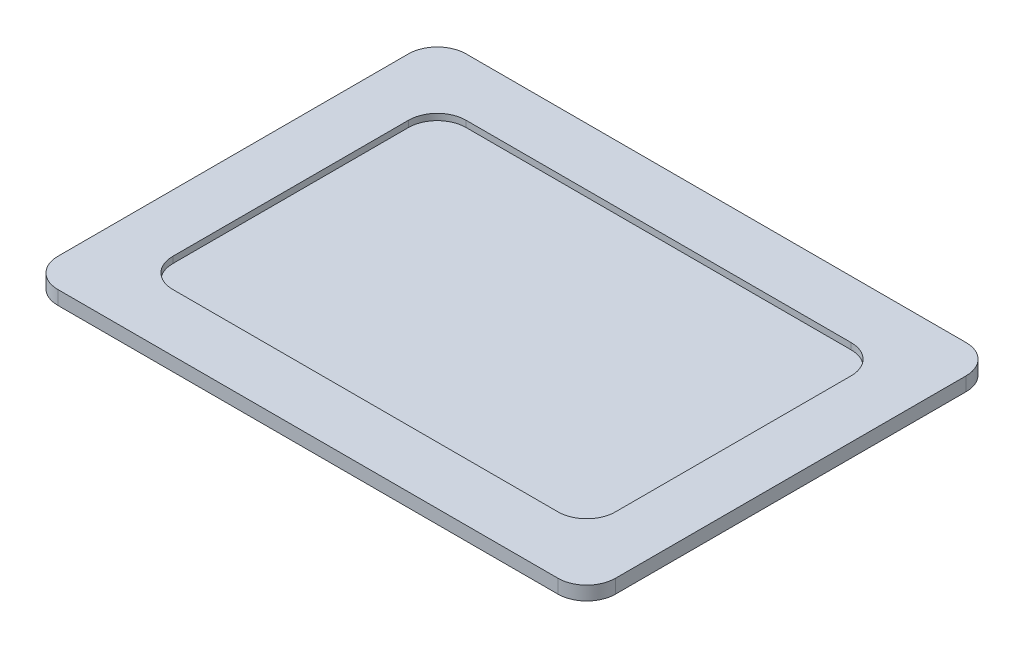
ISO-10303-21;
HEADER;
FILE_DESCRIPTION(('STEP AP214'),'2;1');
FILE_NAME('part.step','',(''),(''),'','','');
FILE_SCHEMA(('AUTOMOTIVE_DESIGN { 1 0 10303 214 1 1 1 1 }'));
ENDSEC;
DATA;
#1=APPLICATION_CONTEXT('core data for automotive mechanical design processes');
#2=APPLICATION_PROTOCOL_DEFINITION('international standard','automotive_design',2000,#1);
#3=PRODUCT_CONTEXT('',#1,'mechanical');
#4=PRODUCT('Part','Part','',(#3));
#5=PRODUCT_RELATED_PRODUCT_CATEGORY('part','',(#4));
#6=PRODUCT_DEFINITION_FORMATION('','',#4);
#7=PRODUCT_DEFINITION_CONTEXT('part definition',#1,'design');
#8=PRODUCT_DEFINITION('design','',#6,#7);
#9=PRODUCT_DEFINITION_SHAPE('','',#8);
#10=(LENGTH_UNIT() NAMED_UNIT(*) SI_UNIT(.MILLI.,.METRE.));
#11=(NAMED_UNIT(*) PLANE_ANGLE_UNIT() SI_UNIT($,.RADIAN.));
#12=(NAMED_UNIT(*) SI_UNIT($,.STERADIAN.) SOLID_ANGLE_UNIT());
#13=UNCERTAINTY_MEASURE_WITH_UNIT(LENGTH_MEASURE(1.E-05),#10,'distance_accuracy_value','');
#14=(GEOMETRIC_REPRESENTATION_CONTEXT(3) GLOBAL_UNCERTAINTY_ASSIGNED_CONTEXT((#13)) GLOBAL_UNIT_ASSIGNED_CONTEXT((#10,
#11,#12)) REPRESENTATION_CONTEXT('',''));
#15=CARTESIAN_POINT('',(0.,0.,0.));
#16=DIRECTION('',(0.,0.,1.));
#17=DIRECTION('',(1.,0.,0.));
#18=AXIS2_PLACEMENT_3D('',#15,#16,#17);
#19=CARTESIAN_POINT('',(48.5,-1.2,35.5));
#20=DIRECTION('',(1.,0.,0.));
#21=DIRECTION('',(0.,0.,-1.));
#22=AXIS2_PLACEMENT_3D('',#19,#20,#21);
#23=PLANE('',#22);
#24=DIRECTION('',(0.,0.,-1.));
#25=VECTOR('',#24,1.);
#26=CARTESIAN_POINT('',(48.5,-1.2,35.5));
#27=LINE('',#26,#25);
#28=CARTESIAN_POINT('',(48.5,-1.2,30.5));
#29=VERTEX_POINT('',#28);
#30=CARTESIAN_POINT('',(48.5,-1.2,-30.5));
#31=VERTEX_POINT('',#30);
#32=EDGE_CURVE('E339',#29,#31,#27,.T.);
#33=ORIENTED_EDGE('',*,*,#32,.T.);
#34=DIRECTION('',(0.,1.,0.));
#35=VECTOR('',#34,1.);
#36=CARTESIAN_POINT('',(48.5,-1.2,-30.5));
#37=LINE('',#36,#35);
#38=CARTESIAN_POINT('',(48.5,1.2,-30.5));
#39=VERTEX_POINT('',#38);
#40=EDGE_CURVE('E300',#31,#39,#37,.T.);
#41=ORIENTED_EDGE('',*,*,#40,.T.);
#42=DIRECTION('',(0.,0.,-1.));
#43=VECTOR('',#42,1.);
#44=CARTESIAN_POINT('',(48.5,1.2,35.5));
#45=LINE('',#44,#43);
#46=CARTESIAN_POINT('',(48.5,1.2,30.5));
#47=VERTEX_POINT('',#46);
#48=EDGE_CURVE('E362',#47,#39,#45,.T.);
#49=ORIENTED_EDGE('',*,*,#48,.F.);
#50=DIRECTION('',(0.,1.,0.));
#51=VECTOR('',#50,1.);
#52=CARTESIAN_POINT('',(48.5,-1.2,30.5));
#53=LINE('',#52,#51);
#54=EDGE_CURVE('E298',#47,#29,#53,.F.);
#55=ORIENTED_EDGE('',*,*,#54,.T.);
#56=EDGE_LOOP('',(#33,#41,#49,#55));
#57=FACE_BOUND('',#56,.T.);
#58=ADVANCED_FACE('F39',(#57),#23,.T.);
#59=CARTESIAN_POINT('',(-48.5,-1.2,35.5));
#60=DIRECTION('',(0.,0.,1.));
#61=DIRECTION('',(1.,0.,0.));
#62=AXIS2_PLACEMENT_3D('',#59,#60,#61);
#63=PLANE('',#62);
#64=DIRECTION('',(1.,0.,0.));
#65=VECTOR('',#64,1.);
#66=CARTESIAN_POINT('',(-48.5,1.2,35.5));
#67=LINE('',#66,#65);
#68=CARTESIAN_POINT('',(-43.5,1.2,35.5));
#69=VERTEX_POINT('',#68);
#70=CARTESIAN_POINT('',(43.5,1.2,35.5));
#71=VERTEX_POINT('',#70);
#72=EDGE_CURVE('E332',#69,#71,#67,.T.);
#73=ORIENTED_EDGE('',*,*,#72,.F.);
#74=DIRECTION('',(0.,1.,0.));
#75=VECTOR('',#74,1.);
#76=CARTESIAN_POINT('',(-43.5,-1.2,35.5));
#77=LINE('',#76,#75);
#78=CARTESIAN_POINT('',(-43.5,-1.2,35.5));
#79=VERTEX_POINT('',#78);
#80=EDGE_CURVE('E12',#69,#79,#77,.F.);
#81=ORIENTED_EDGE('',*,*,#80,.T.);
#82=DIRECTION('',(1.,0.,0.));
#83=VECTOR('',#82,1.);
#84=CARTESIAN_POINT('',(-48.5,-1.2,35.5));
#85=LINE('',#84,#83);
#86=CARTESIAN_POINT('',(43.5,-1.2,35.5));
#87=VERTEX_POINT('',#86);
#88=EDGE_CURVE('E229',#79,#87,#85,.T.);
#89=ORIENTED_EDGE('',*,*,#88,.T.);
#90=DIRECTION('',(0.,1.,0.));
#91=VECTOR('',#90,1.);
#92=CARTESIAN_POINT('',(43.5,-1.2,35.5));
#93=LINE('',#92,#91);
#94=EDGE_CURVE('E47',#87,#71,#93,.T.);
#95=ORIENTED_EDGE('',*,*,#94,.T.);
#96=EDGE_LOOP('',(#73,#81,#89,#95));
#97=FACE_BOUND('',#96,.T.);
#98=ADVANCED_FACE('F331',(#97),#63,.T.);
#99=CARTESIAN_POINT('',(-48.5,-1.2,35.5));
#100=DIRECTION('',(-1.,0.,0.));
#101=DIRECTION('',(0.,0.,1.));
#102=AXIS2_PLACEMENT_3D('',#99,#100,#101);
#103=PLANE('',#102);
#104=DIRECTION('',(0.,0.,1.));
#105=VECTOR('',#104,1.);
#106=CARTESIAN_POINT('',(-48.5,-1.2,35.5));
#107=LINE('',#106,#105);
#108=CARTESIAN_POINT('',(-48.5,-1.2,-30.5));
#109=VERTEX_POINT('',#108);
#110=CARTESIAN_POINT('',(-48.5,-1.2,30.5));
#111=VERTEX_POINT('',#110);
#112=EDGE_CURVE('E234',#109,#111,#107,.T.);
#113=ORIENTED_EDGE('',*,*,#112,.T.);
#114=DIRECTION('',(0.,1.,0.));
#115=VECTOR('',#114,1.);
#116=CARTESIAN_POINT('',(-48.5,-1.2,30.5));
#117=LINE('',#116,#115);
#118=CARTESIAN_POINT('',(-48.5,1.2,30.5));
#119=VERTEX_POINT('',#118);
#120=EDGE_CURVE('E324',#111,#119,#117,.T.);
#121=ORIENTED_EDGE('',*,*,#120,.T.);
#122=DIRECTION('',(0.,0.,1.));
#123=VECTOR('',#122,1.);
#124=CARTESIAN_POINT('',(-48.5,1.2,35.5));
#125=LINE('',#124,#123);
#126=CARTESIAN_POINT('',(-48.5,1.2,-30.5));
#127=VERTEX_POINT('',#126);
#128=EDGE_CURVE('E340',#127,#119,#125,.T.);
#129=ORIENTED_EDGE('',*,*,#128,.F.);
#130=DIRECTION('',(0.,1.,0.));
#131=VECTOR('',#130,1.);
#132=CARTESIAN_POINT('',(-48.5,-1.2,-30.5));
#133=LINE('',#132,#131);
#134=EDGE_CURVE('E61',#127,#109,#133,.F.);
#135=ORIENTED_EDGE('',*,*,#134,.T.);
#136=EDGE_LOOP('',(#113,#121,#129,#135));
#137=FACE_BOUND('',#136,.T.);
#138=ADVANCED_FACE('F351',(#137),#103,.T.);
#139=CARTESIAN_POINT('',(-48.5,-1.2,-35.5));
#140=DIRECTION('',(0.,0.,-1.));
#141=DIRECTION('',(-1.,0.,0.));
#142=AXIS2_PLACEMENT_3D('',#139,#140,#141);
#143=PLANE('',#142);
#144=DIRECTION('',(-1.,0.,0.));
#145=VECTOR('',#144,1.);
#146=CARTESIAN_POINT('',(-48.5,1.2,-35.5));
#147=LINE('',#146,#145);
#148=CARTESIAN_POINT('',(43.5,1.2,-35.5));
#149=VERTEX_POINT('',#148);
#150=CARTESIAN_POINT('',(-43.5,1.2,-35.5));
#151=VERTEX_POINT('',#150);
#152=EDGE_CURVE('E345',#149,#151,#147,.T.);
#153=ORIENTED_EDGE('',*,*,#152,.F.);
#154=DIRECTION('',(0.,1.,0.));
#155=VECTOR('',#154,1.);
#156=CARTESIAN_POINT('',(43.5,-1.2,-35.5));
#157=LINE('',#156,#155);
#158=CARTESIAN_POINT('',(43.5,-1.2,-35.5));
#159=VERTEX_POINT('',#158);
#160=EDGE_CURVE('E314',#149,#159,#157,.F.);
#161=ORIENTED_EDGE('',*,*,#160,.T.);
#162=DIRECTION('',(-1.,0.,0.));
#163=VECTOR('',#162,1.);
#164=CARTESIAN_POINT('',(-48.5,-1.2,-35.5));
#165=LINE('',#164,#163);
#166=CARTESIAN_POINT('',(-43.5,-1.2,-35.5));
#167=VERTEX_POINT('',#166);
#168=EDGE_CURVE('E343',#159,#167,#165,.T.);
#169=ORIENTED_EDGE('',*,*,#168,.T.);
#170=DIRECTION('',(0.,1.,0.));
#171=VECTOR('',#170,1.);
#172=CARTESIAN_POINT('',(-43.5,-1.2,-35.5));
#173=LINE('',#172,#171);
#174=EDGE_CURVE('E311',#167,#151,#173,.T.);
#175=ORIENTED_EDGE('',*,*,#174,.T.);
#176=EDGE_LOOP('',(#153,#161,#169,#175));
#177=FACE_BOUND('',#176,.T.);
#178=ADVANCED_FACE('F462',(#177),#143,.T.);
#179=CARTESIAN_POINT('',(0.,-1.2,0.));
#180=DIRECTION('',(0.,-1.,0.));
#181=DIRECTION('',(0.,0.,-1.));
#182=AXIS2_PLACEMENT_3D('',#179,#180,#181);
#183=PLANE('',#182);
#184=DIRECTION('',(0.,0.,-1.));
#185=VECTOR('',#184,1.);
#186=CARTESIAN_POINT('',(-38.5,-1.2,25.5));
#187=LINE('',#186,#185);
#188=CARTESIAN_POINT('',(-38.5,-1.2,20.5));
#189=VERTEX_POINT('',#188);
#190=CARTESIAN_POINT('',(-38.5,-1.2,-20.5));
#191=VERTEX_POINT('',#190);
#192=EDGE_CURVE('E392',#189,#191,#187,.T.);
#193=ORIENTED_EDGE('',*,*,#192,.F.);
#194=CARTESIAN_POINT('',(-33.5,-1.20000000000001,20.5));
#195=DIRECTION('',(0.,-1.,0.));
#196=DIRECTION('',(0.,0.,-1.));
#197=AXIS2_PLACEMENT_3D('',#194,#195,#196);
#198=CIRCLE('',#197,5.);
#199=CARTESIAN_POINT('',(-33.5,-1.2,25.5));
#200=VERTEX_POINT('',#199);
#201=EDGE_CURVE('E292',#189,#200,#198,.F.);
#202=ORIENTED_EDGE('',*,*,#201,.T.);
#203=DIRECTION('',(1.,0.,0.));
#204=VECTOR('',#203,1.);
#205=CARTESIAN_POINT('',(-38.5,-1.2,25.5));
#206=LINE('',#205,#204);
#207=CARTESIAN_POINT('',(33.5,-1.2,25.5));
#208=VERTEX_POINT('',#207);
#209=EDGE_CURVE('E377',#200,#208,#206,.T.);
#210=ORIENTED_EDGE('',*,*,#209,.T.);
#211=CARTESIAN_POINT('',(33.5,-1.20000000000001,20.5));
#212=DIRECTION('',(0.,-1.,0.));
#213=DIRECTION('',(0.,0.,-1.));
#214=AXIS2_PLACEMENT_3D('',#211,#212,#213);
#215=CIRCLE('',#214,5.);
#216=CARTESIAN_POINT('',(38.5,-1.2,20.5));
#217=VERTEX_POINT('',#216);
#218=EDGE_CURVE('E294',#208,#217,#215,.F.);
#219=ORIENTED_EDGE('',*,*,#218,.T.);
#220=DIRECTION('',(0.,0.,-1.));
#221=VECTOR('',#220,1.);
#222=CARTESIAN_POINT('',(38.5,-1.2,25.5));
#223=LINE('',#222,#221);
#224=CARTESIAN_POINT('',(38.5,-1.2,-20.5));
#225=VERTEX_POINT('',#224);
#226=EDGE_CURVE('E387',#217,#225,#223,.T.);
#227=ORIENTED_EDGE('',*,*,#226,.T.);
#228=CARTESIAN_POINT('',(33.5,-1.20000000000001,-20.5));
#229=DIRECTION('',(0.,-1.,0.));
#230=DIRECTION('',(0.,0.,-1.));
#231=AXIS2_PLACEMENT_3D('',#228,#229,#230);
#232=CIRCLE('',#231,5.);
#233=CARTESIAN_POINT('',(33.5,-1.2,-25.5));
#234=VERTEX_POINT('',#233);
#235=EDGE_CURVE('E290',#225,#234,#232,.F.);
#236=ORIENTED_EDGE('',*,*,#235,.T.);
#237=DIRECTION('',(1.,0.,0.));
#238=VECTOR('',#237,1.);
#239=CARTESIAN_POINT('',(-38.5,-1.2,-25.5));
#240=LINE('',#239,#238);
#241=CARTESIAN_POINT('',(-33.5,-1.2,-25.5));
#242=VERTEX_POINT('',#241);
#243=EDGE_CURVE('E398',#242,#234,#240,.T.);
#244=ORIENTED_EDGE('',*,*,#243,.F.);
#245=CARTESIAN_POINT('',(-33.5,-1.20000000000001,-20.5));
#246=DIRECTION('',(0.,-1.,0.));
#247=DIRECTION('',(0.,0.,-1.));
#248=AXIS2_PLACEMENT_3D('',#245,#246,#247);
#249=CIRCLE('',#248,5.);
#250=EDGE_CURVE('E296',#242,#191,#249,.F.);
#251=ORIENTED_EDGE('',*,*,#250,.T.);
#252=EDGE_LOOP('',(#193,#202,#210,#219,#227,#236,#244,#251));
#253=FACE_BOUND('',#252,.T.);
#254=ORIENTED_EDGE('',*,*,#168,.F.);
#255=CARTESIAN_POINT('',(43.5,-1.2,-30.5));
#256=DIRECTION('',(0.,-1.,0.));
#257=DIRECTION('',(0.,0.,-1.));
#258=AXIS2_PLACEMENT_3D('',#255,#256,#257);
#259=CIRCLE('',#258,5.);
#260=EDGE_CURVE('E321',#159,#31,#259,.T.);
#261=ORIENTED_EDGE('',*,*,#260,.T.);
#262=ORIENTED_EDGE('',*,*,#32,.F.);
#263=CARTESIAN_POINT('',(43.5,-1.2,30.5));
#264=DIRECTION('',(0.,-1.,0.));
#265=DIRECTION('',(0.,0.,-1.));
#266=AXIS2_PLACEMENT_3D('',#263,#264,#265);
#267=CIRCLE('',#266,5.);
#268=EDGE_CURVE('E318',#29,#87,#267,.T.);
#269=ORIENTED_EDGE('',*,*,#268,.T.);
#270=ORIENTED_EDGE('',*,*,#88,.F.);
#271=CARTESIAN_POINT('',(-43.5,-1.2,30.5));
#272=DIRECTION('',(0.,-1.,0.));
#273=DIRECTION('',(0.,0.,-1.));
#274=AXIS2_PLACEMENT_3D('',#271,#272,#273);
#275=CIRCLE('',#274,5.);
#276=EDGE_CURVE('E54',#79,#111,#275,.T.);
#277=ORIENTED_EDGE('',*,*,#276,.T.);
#278=ORIENTED_EDGE('',*,*,#112,.F.);
#279=CARTESIAN_POINT('',(-43.5,-1.2,-30.5));
#280=DIRECTION('',(0.,-1.,0.));
#281=DIRECTION('',(0.,0.,-1.));
#282=AXIS2_PLACEMENT_3D('',#279,#280,#281);
#283=CIRCLE('',#282,5.);
#284=EDGE_CURVE('E316',#109,#167,#283,.T.);
#285=ORIENTED_EDGE('',*,*,#284,.T.);
#286=EDGE_LOOP('',(#254,#261,#262,#269,#270,#277,#278,#285));
#287=FACE_BOUND('',#286,.T.);
#288=ADVANCED_FACE('F356',(#253,#287),#183,.T.);
#289=CARTESIAN_POINT('',(0.,1.2,0.));
#290=DIRECTION('',(0.,-1.,0.));
#291=DIRECTION('',(0.,0.,-1.));
#292=AXIS2_PLACEMENT_3D('',#289,#290,#291);
#293=PLANE('',#292);
#294=DIRECTION('',(0.,0.,-1.));
#295=VECTOR('',#294,1.);
#296=CARTESIAN_POINT('',(38.5,1.2,25.5));
#297=LINE('',#296,#295);
#298=CARTESIAN_POINT('',(38.5,1.2,20.5));
#299=VERTEX_POINT('',#298);
#300=CARTESIAN_POINT('',(38.5,1.2,-20.5));
#301=VERTEX_POINT('',#300);
#302=EDGE_CURVE('E224',#299,#301,#297,.T.);
#303=ORIENTED_EDGE('',*,*,#302,.F.);
#304=CARTESIAN_POINT('',(33.5,1.20000000000001,20.5));
#305=DIRECTION('',(0.,-1.,0.));
#306=DIRECTION('',(0.,0.,-1.));
#307=AXIS2_PLACEMENT_3D('',#304,#305,#306);
#308=CIRCLE('',#307,5.);
#309=CARTESIAN_POINT('',(33.5,1.2,25.5));
#310=VERTEX_POINT('',#309);
#311=EDGE_CURVE('E214',#299,#310,#308,.T.);
#312=ORIENTED_EDGE('',*,*,#311,.T.);
#313=DIRECTION('',(1.,0.,0.));
#314=VECTOR('',#313,1.);
#315=CARTESIAN_POINT('',(-38.5,1.2,25.5));
#316=LINE('',#315,#314);
#317=CARTESIAN_POINT('',(-33.5,1.2,25.5));
#318=VERTEX_POINT('',#317);
#319=EDGE_CURVE('E374',#318,#310,#316,.T.);
#320=ORIENTED_EDGE('',*,*,#319,.F.);
#321=CARTESIAN_POINT('',(-33.5,1.20000000000001,20.5));
#322=DIRECTION('',(0.,-1.,0.));
#323=DIRECTION('',(0.,0.,-1.));
#324=AXIS2_PLACEMENT_3D('',#321,#322,#323);
#325=CIRCLE('',#324,5.);
#326=CARTESIAN_POINT('',(-38.5,1.2,20.5));
#327=VERTEX_POINT('',#326);
#328=EDGE_CURVE('E260',#318,#327,#325,.T.);
#329=ORIENTED_EDGE('',*,*,#328,.T.);
#330=DIRECTION('',(0.,0.,-1.));
#331=VECTOR('',#330,1.);
#332=CARTESIAN_POINT('',(-38.5,1.2,25.5));
#333=LINE('',#332,#331);
#334=CARTESIAN_POINT('',(-38.5,1.2,-20.5));
#335=VERTEX_POINT('',#334);
#336=EDGE_CURVE('E208',#327,#335,#333,.T.);
#337=ORIENTED_EDGE('',*,*,#336,.T.);
#338=CARTESIAN_POINT('',(-33.5,1.20000000000001,-20.5));
#339=DIRECTION('',(0.,-1.,0.));
#340=DIRECTION('',(0.,0.,-1.));
#341=AXIS2_PLACEMENT_3D('',#338,#339,#340);
#342=CIRCLE('',#341,5.);
#343=CARTESIAN_POINT('',(-33.5,1.2,-25.5));
#344=VERTEX_POINT('',#343);
#345=EDGE_CURVE('E201',#335,#344,#342,.T.);
#346=ORIENTED_EDGE('',*,*,#345,.T.);
#347=DIRECTION('',(1.,0.,0.));
#348=VECTOR('',#347,1.);
#349=CARTESIAN_POINT('',(-38.5,1.2,-25.5));
#350=LINE('',#349,#348);
#351=CARTESIAN_POINT('',(33.5,1.2,-25.5));
#352=VERTEX_POINT('',#351);
#353=EDGE_CURVE('E206',#344,#352,#350,.T.);
#354=ORIENTED_EDGE('',*,*,#353,.T.);
#355=CARTESIAN_POINT('',(33.5,1.20000000000001,-20.5));
#356=DIRECTION('',(0.,-1.,0.));
#357=DIRECTION('',(0.,0.,-1.));
#358=AXIS2_PLACEMENT_3D('',#355,#356,#357);
#359=CIRCLE('',#358,5.);
#360=EDGE_CURVE('E258',#352,#301,#359,.T.);
#361=ORIENTED_EDGE('',*,*,#360,.T.);
#362=EDGE_LOOP('',(#303,#312,#320,#329,#337,#346,#354,#361));
#363=FACE_BOUND('',#362,.T.);
#364=ORIENTED_EDGE('',*,*,#48,.T.);
#365=CARTESIAN_POINT('',(43.5,1.2,-30.5));
#366=DIRECTION('',(0.,-1.,0.));
#367=DIRECTION('',(0.,0.,-1.));
#368=AXIS2_PLACEMENT_3D('',#365,#366,#367);
#369=CIRCLE('',#368,5.);
#370=EDGE_CURVE('E309',#39,#149,#369,.F.);
#371=ORIENTED_EDGE('',*,*,#370,.T.);
#372=ORIENTED_EDGE('',*,*,#152,.T.);
#373=CARTESIAN_POINT('',(-43.5,1.2,-30.5));
#374=DIRECTION('',(0.,-1.,0.));
#375=DIRECTION('',(0.,0.,-1.));
#376=AXIS2_PLACEMENT_3D('',#373,#374,#375);
#377=CIRCLE('',#376,5.);
#378=EDGE_CURVE('E303',#151,#127,#377,.F.);
#379=ORIENTED_EDGE('',*,*,#378,.T.);
#380=ORIENTED_EDGE('',*,*,#128,.T.);
#381=CARTESIAN_POINT('',(-43.5,1.2,30.5));
#382=DIRECTION('',(0.,-1.,0.));
#383=DIRECTION('',(0.,0.,-1.));
#384=AXIS2_PLACEMENT_3D('',#381,#382,#383);
#385=CIRCLE('',#384,5.);
#386=EDGE_CURVE('E307',#119,#69,#385,.F.);
#387=ORIENTED_EDGE('',*,*,#386,.T.);
#388=ORIENTED_EDGE('',*,*,#72,.T.);
#389=CARTESIAN_POINT('',(43.5,1.2,30.5));
#390=DIRECTION('',(0.,-1.,0.));
#391=DIRECTION('',(0.,0.,-1.));
#392=AXIS2_PLACEMENT_3D('',#389,#390,#391);
#393=CIRCLE('',#392,5.);
#394=EDGE_CURVE('E305',#71,#47,#393,.F.);
#395=ORIENTED_EDGE('',*,*,#394,.T.);
#396=EDGE_LOOP('',(#364,#371,#372,#379,#380,#387,#388,#395));
#397=FACE_BOUND('',#396,.T.);
#398=ADVANCED_FACE('F204',(#363,#397),#293,.F.);
#399=CARTESIAN_POINT('',(-38.5,-92.3579991121505,25.5));
#400=DIRECTION('',(0.,0.,1.));
#401=DIRECTION('',(1.,0.,0.));
#402=AXIS2_PLACEMENT_3D('',#399,#400,#401);
#403=PLANE('',#402);
#404=DIRECTION('',(-1.,0.,0.));
#405=VECTOR('',#404,1.);
#406=CARTESIAN_POINT('',(-38.5,0.100000000000003,25.5));
#407=LINE('',#406,#405);
#408=CARTESIAN_POINT('',(33.5,0.100000000000003,25.5));
#409=VERTEX_POINT('',#408);
#410=CARTESIAN_POINT('',(-33.5,0.100000000000003,25.5));
#411=VERTEX_POINT('',#410);
#412=EDGE_CURVE('E367',#409,#411,#407,.T.);
#413=ORIENTED_EDGE('',*,*,#412,.T.);
#414=DIRECTION('',(0.,1.,0.));
#415=VECTOR('',#414,1.);
#416=CARTESIAN_POINT('',(-33.5,-92.3579991121505,25.5));
#417=LINE('',#416,#415);
#418=EDGE_CURVE('E251',#411,#318,#417,.T.);
#419=ORIENTED_EDGE('',*,*,#418,.T.);
#420=ORIENTED_EDGE('',*,*,#319,.T.);
#421=DIRECTION('',(0.,1.,0.));
#422=VECTOR('',#421,1.);
#423=CARTESIAN_POINT('',(33.5,0.100000000000003,25.5));
#424=LINE('',#423,#422);
#425=EDGE_CURVE('E249',#310,#409,#424,.F.);
#426=ORIENTED_EDGE('',*,*,#425,.T.);
#427=EDGE_LOOP('',(#413,#419,#420,#426));
#428=FACE_BOUND('',#427,.T.);
#429=ADVANCED_FACE('F494',(#428),#403,.F.);
#430=CARTESIAN_POINT('',(-38.5,-92.3579991121505,25.5));
#431=DIRECTION('',(1.,0.,0.));
#432=DIRECTION('',(0.,0.,-1.));
#433=AXIS2_PLACEMENT_3D('',#430,#431,#432);
#434=PLANE('',#433);
#435=ORIENTED_EDGE('',*,*,#336,.F.);
#436=DIRECTION('',(0.,1.,0.));
#437=VECTOR('',#436,1.);
#438=CARTESIAN_POINT('',(-38.5,-92.3579991121505,20.5));
#439=LINE('',#438,#437);
#440=CARTESIAN_POINT('',(-38.5,0.100000000000003,20.5));
#441=VERTEX_POINT('',#440);
#442=EDGE_CURVE('E256',#327,#441,#439,.F.);
#443=ORIENTED_EDGE('',*,*,#442,.T.);
#444=DIRECTION('',(0.,0.,1.));
#445=VECTOR('',#444,1.);
#446=CARTESIAN_POINT('',(-38.5,0.100000000000003,25.5));
#447=LINE('',#446,#445);
#448=CARTESIAN_POINT('',(-38.5,0.100000000000003,-20.5));
#449=VERTEX_POINT('',#448);
#450=EDGE_CURVE('E380',#449,#441,#447,.T.);
#451=ORIENTED_EDGE('',*,*,#450,.F.);
#452=DIRECTION('',(0.,1.,0.));
#453=VECTOR('',#452,1.);
#454=CARTESIAN_POINT('',(-38.5,1.20000000000001,-20.5));
#455=LINE('',#454,#453);
#456=EDGE_CURVE('E254',#449,#335,#455,.T.);
#457=ORIENTED_EDGE('',*,*,#456,.T.);
#458=EDGE_LOOP('',(#435,#443,#451,#457));
#459=FACE_BOUND('',#458,.T.);
#460=ADVANCED_FACE('F491',(#459),#434,.T.);
#461=CARTESIAN_POINT('',(-38.5,-92.3579991121505,-25.5));
#462=DIRECTION('',(0.,0.,1.));
#463=DIRECTION('',(1.,0.,0.));
#464=AXIS2_PLACEMENT_3D('',#461,#462,#463);
#465=PLANE('',#464);
#466=DIRECTION('',(-1.,0.,0.));
#467=VECTOR('',#466,1.);
#468=CARTESIAN_POINT('',(-38.5,0.100000000000003,-25.5));
#469=LINE('',#468,#467);
#470=CARTESIAN_POINT('',(33.5,0.100000000000003,-25.5));
#471=VERTEX_POINT('',#470);
#472=CARTESIAN_POINT('',(-33.5,0.100000000000003,-25.5));
#473=VERTEX_POINT('',#472);
#474=EDGE_CURVE('E370',#471,#473,#469,.T.);
#475=ORIENTED_EDGE('',*,*,#474,.F.);
#476=DIRECTION('',(0.,1.,0.));
#477=VECTOR('',#476,1.);
#478=CARTESIAN_POINT('',(33.5,-92.3579991121505,-25.5));
#479=LINE('',#478,#477);
#480=EDGE_CURVE('E223',#471,#352,#479,.T.);
#481=ORIENTED_EDGE('',*,*,#480,.T.);
#482=ORIENTED_EDGE('',*,*,#353,.F.);
#483=DIRECTION('',(0.,1.,0.));
#484=VECTOR('',#483,1.);
#485=CARTESIAN_POINT('',(-33.5,0.100000000000003,-25.5));
#486=LINE('',#485,#484);
#487=EDGE_CURVE('E220',#344,#473,#486,.F.);
#488=ORIENTED_EDGE('',*,*,#487,.T.);
#489=EDGE_LOOP('',(#475,#481,#482,#488));
#490=FACE_BOUND('',#489,.T.);
#491=ADVANCED_FACE('F219',(#490),#465,.T.);
#492=CARTESIAN_POINT('',(38.5,-92.3579991121505,25.5));
#493=DIRECTION('',(1.,0.,0.));
#494=DIRECTION('',(0.,0.,-1.));
#495=AXIS2_PLACEMENT_3D('',#492,#493,#494);
#496=PLANE('',#495);
#497=ORIENTED_EDGE('',*,*,#302,.T.);
#498=DIRECTION('',(0.,1.,0.));
#499=VECTOR('',#498,1.);
#500=CARTESIAN_POINT('',(38.5,-92.3579991121505,-20.5));
#501=LINE('',#500,#499);
#502=CARTESIAN_POINT('',(38.5,0.100000000000003,-20.5));
#503=VERTEX_POINT('',#502);
#504=EDGE_CURVE('E240',#301,#503,#501,.F.);
#505=ORIENTED_EDGE('',*,*,#504,.T.);
#506=DIRECTION('',(0.,0.,1.));
#507=VECTOR('',#506,1.);
#508=CARTESIAN_POINT('',(38.5,0.100000000000003,25.5));
#509=LINE('',#508,#507);
#510=CARTESIAN_POINT('',(38.5,0.100000000000003,20.5));
#511=VERTEX_POINT('',#510);
#512=EDGE_CURVE('E363',#503,#511,#509,.T.);
#513=ORIENTED_EDGE('',*,*,#512,.T.);
#514=DIRECTION('',(0.,1.,0.));
#515=VECTOR('',#514,1.);
#516=CARTESIAN_POINT('',(38.5,1.20000000000001,20.5));
#517=LINE('',#516,#515);
#518=EDGE_CURVE('E231',#511,#299,#517,.T.);
#519=ORIENTED_EDGE('',*,*,#518,.T.);
#520=EDGE_LOOP('',(#497,#505,#513,#519));
#521=FACE_BOUND('',#520,.T.);
#522=ADVANCED_FACE('F489',(#521),#496,.F.);
#523=CARTESIAN_POINT('',(0.,0.1,0.));
#524=DIRECTION('',(0.,1.,0.));
#525=DIRECTION('',(0.,0.,1.));
#526=AXIS2_PLACEMENT_3D('',#523,#524,#525);
#527=PLANE('',#526);
#528=ORIENTED_EDGE('',*,*,#512,.F.);
#529=CARTESIAN_POINT('',(33.5,0.100000000000003,-20.5));
#530=DIRECTION('',(0.,1.,0.));
#531=DIRECTION('',(0.,0.,1.));
#532=AXIS2_PLACEMENT_3D('',#529,#530,#531);
#533=CIRCLE('',#532,5.);
#534=EDGE_CURVE('E247',#503,#471,#533,.T.);
#535=ORIENTED_EDGE('',*,*,#534,.T.);
#536=ORIENTED_EDGE('',*,*,#474,.T.);
#537=CARTESIAN_POINT('',(-33.5,0.100000000000003,-20.5));
#538=DIRECTION('',(0.,1.,0.));
#539=DIRECTION('',(0.,0.,1.));
#540=AXIS2_PLACEMENT_3D('',#537,#538,#539);
#541=CIRCLE('',#540,5.);
#542=EDGE_CURVE('E228',#473,#449,#541,.T.);
#543=ORIENTED_EDGE('',*,*,#542,.T.);
#544=ORIENTED_EDGE('',*,*,#450,.T.);
#545=CARTESIAN_POINT('',(-33.5,0.100000000000003,20.5));
#546=DIRECTION('',(0.,1.,0.));
#547=DIRECTION('',(0.,0.,1.));
#548=AXIS2_PLACEMENT_3D('',#545,#546,#547);
#549=CIRCLE('',#548,5.);
#550=EDGE_CURVE('E245',#441,#411,#549,.T.);
#551=ORIENTED_EDGE('',*,*,#550,.T.);
#552=ORIENTED_EDGE('',*,*,#412,.F.);
#553=CARTESIAN_POINT('',(33.5,0.100000000000003,20.5));
#554=DIRECTION('',(0.,1.,0.));
#555=DIRECTION('',(0.,0.,1.));
#556=AXIS2_PLACEMENT_3D('',#553,#554,#555);
#557=CIRCLE('',#556,5.);
#558=EDGE_CURVE('E243',#409,#511,#557,.T.);
#559=ORIENTED_EDGE('',*,*,#558,.T.);
#560=EDGE_LOOP('',(#528,#535,#536,#543,#544,#551,#552,#559));
#561=FACE_BOUND('',#560,.T.);
#562=ADVANCED_FACE('F468',(#561),#527,.T.);
#563=CARTESIAN_POINT('',(33.5,-92.3579991121505,-20.5));
#564=DIRECTION('',(0.,1.,0.));
#565=DIRECTION('',(0.,0.,1.));
#566=AXIS2_PLACEMENT_3D('',#563,#564,#565);
#567=CYLINDRICAL_SURFACE('',#566,5.);
#568=ORIENTED_EDGE('',*,*,#534,.F.);
#569=ORIENTED_EDGE('',*,*,#504,.F.);
#570=ORIENTED_EDGE('',*,*,#360,.F.);
#571=ORIENTED_EDGE('',*,*,#480,.F.);
#572=EDGE_LOOP('',(#568,#569,#570,#571));
#573=FACE_BOUND('',#572,.T.);
#574=ADVANCED_FACE('F464',(#573),#567,.F.);
#575=CARTESIAN_POINT('',(-33.5,-92.3579991121505,20.5));
#576=DIRECTION('',(0.,1.,0.));
#577=DIRECTION('',(0.,0.,1.));
#578=AXIS2_PLACEMENT_3D('',#575,#576,#577);
#579=CYLINDRICAL_SURFACE('',#578,5.);
#580=ORIENTED_EDGE('',*,*,#550,.F.);
#581=ORIENTED_EDGE('',*,*,#442,.F.);
#582=ORIENTED_EDGE('',*,*,#328,.F.);
#583=ORIENTED_EDGE('',*,*,#418,.F.);
#584=EDGE_LOOP('',(#580,#581,#582,#583));
#585=FACE_BOUND('',#584,.T.);
#586=ADVANCED_FACE('F467',(#585),#579,.F.);
#587=CARTESIAN_POINT('',(33.5,-92.3579991121505,20.5));
#588=DIRECTION('',(0.,-1.,0.));
#589=DIRECTION('',(0.,0.,-1.));
#590=AXIS2_PLACEMENT_3D('',#587,#588,#589);
#591=CYLINDRICAL_SURFACE('',#590,5.);
#592=ORIENTED_EDGE('',*,*,#558,.F.);
#593=ORIENTED_EDGE('',*,*,#425,.F.);
#594=ORIENTED_EDGE('',*,*,#311,.F.);
#595=ORIENTED_EDGE('',*,*,#518,.F.);
#596=EDGE_LOOP('',(#592,#593,#594,#595));
#597=FACE_BOUND('',#596,.T.);
#598=ADVANCED_FACE('F472',(#597),#591,.F.);
#599=CARTESIAN_POINT('',(-33.5,-92.3579991121505,-20.5));
#600=DIRECTION('',(0.,-1.,0.));
#601=DIRECTION('',(0.,0.,-1.));
#602=AXIS2_PLACEMENT_3D('',#599,#600,#601);
#603=CYLINDRICAL_SURFACE('',#602,5.);
#604=ORIENTED_EDGE('',*,*,#542,.F.);
#605=ORIENTED_EDGE('',*,*,#487,.F.);
#606=ORIENTED_EDGE('',*,*,#345,.F.);
#607=ORIENTED_EDGE('',*,*,#456,.F.);
#608=EDGE_LOOP('',(#604,#605,#606,#607));
#609=FACE_BOUND('',#608,.T.);
#610=ADVANCED_FACE('F227',(#609),#603,.F.);
#611=CARTESIAN_POINT('',(0.,-0.1,0.));
#612=DIRECTION('',(0.,1.,0.));
#613=DIRECTION('',(0.,0.,1.));
#614=AXIS2_PLACEMENT_3D('',#611,#612,#613);
#615=PLANE('',#614);
#616=DIRECTION('',(1.,0.,0.));
#617=VECTOR('',#616,1.);
#618=CARTESIAN_POINT('',(-38.5,-0.100000000000003,-25.5));
#619=LINE('',#618,#617);
#620=CARTESIAN_POINT('',(-33.5,-0.100000000000003,-25.5));
#621=VERTEX_POINT('',#620);
#622=CARTESIAN_POINT('',(33.5,-0.100000000000003,-25.5));
#623=VERTEX_POINT('',#622);
#624=EDGE_CURVE('E384',#621,#623,#619,.T.);
#625=ORIENTED_EDGE('',*,*,#624,.T.);
#626=CARTESIAN_POINT('',(33.5,-0.100000000000003,-20.5));
#627=DIRECTION('',(0.,1.,0.));
#628=DIRECTION('',(0.,0.,1.));
#629=AXIS2_PLACEMENT_3D('',#626,#627,#628);
#630=CIRCLE('',#629,5.);
#631=CARTESIAN_POINT('',(38.5,-0.100000000000003,-20.5));
#632=VERTEX_POINT('',#631);
#633=EDGE_CURVE('E278',#623,#632,#630,.F.);
#634=ORIENTED_EDGE('',*,*,#633,.T.);
#635=DIRECTION('',(0.,0.,-1.));
#636=VECTOR('',#635,1.);
#637=CARTESIAN_POINT('',(38.5,-0.100000000000003,25.5));
#638=LINE('',#637,#636);
#639=CARTESIAN_POINT('',(38.5,-0.100000000000003,20.5));
#640=VERTEX_POINT('',#639);
#641=EDGE_CURVE('E389',#640,#632,#638,.T.);
#642=ORIENTED_EDGE('',*,*,#641,.F.);
#643=CARTESIAN_POINT('',(33.5,-0.100000000000003,20.5));
#644=DIRECTION('',(0.,1.,0.));
#645=DIRECTION('',(0.,0.,1.));
#646=AXIS2_PLACEMENT_3D('',#643,#644,#645);
#647=CIRCLE('',#646,5.);
#648=CARTESIAN_POINT('',(33.5,-0.100000000000003,25.5));
#649=VERTEX_POINT('',#648);
#650=EDGE_CURVE('E274',#640,#649,#647,.F.);
#651=ORIENTED_EDGE('',*,*,#650,.T.);
#652=DIRECTION('',(1.,0.,0.));
#653=VECTOR('',#652,1.);
#654=CARTESIAN_POINT('',(-38.5,-0.100000000000003,25.5));
#655=LINE('',#654,#653);
#656=CARTESIAN_POINT('',(-33.5,-0.100000000000003,25.5));
#657=VERTEX_POINT('',#656);
#658=EDGE_CURVE('E393',#657,#649,#655,.T.);
#659=ORIENTED_EDGE('',*,*,#658,.F.);
#660=CARTESIAN_POINT('',(-33.5,-0.100000000000003,20.5));
#661=DIRECTION('',(0.,1.,0.));
#662=DIRECTION('',(0.,0.,1.));
#663=AXIS2_PLACEMENT_3D('',#660,#661,#662);
#664=CIRCLE('',#663,5.);
#665=CARTESIAN_POINT('',(-38.5,-0.100000000000003,20.5));
#666=VERTEX_POINT('',#665);
#667=EDGE_CURVE('E276',#657,#666,#664,.F.);
#668=ORIENTED_EDGE('',*,*,#667,.T.);
#669=DIRECTION('',(0.,0.,-1.));
#670=VECTOR('',#669,1.);
#671=CARTESIAN_POINT('',(-38.5,-0.100000000000003,25.5));
#672=LINE('',#671,#670);
#673=CARTESIAN_POINT('',(-38.5,-0.100000000000003,-20.5));
#674=VERTEX_POINT('',#673);
#675=EDGE_CURVE('E388',#666,#674,#672,.T.);
#676=ORIENTED_EDGE('',*,*,#675,.T.);
#677=CARTESIAN_POINT('',(-33.5,-0.100000000000003,-20.5));
#678=DIRECTION('',(0.,1.,0.));
#679=DIRECTION('',(0.,0.,1.));
#680=AXIS2_PLACEMENT_3D('',#677,#678,#679);
#681=CIRCLE('',#680,5.);
#682=EDGE_CURVE('E272',#674,#621,#681,.F.);
#683=ORIENTED_EDGE('',*,*,#682,.T.);
#684=EDGE_LOOP('',(#625,#634,#642,#651,#659,#668,#676,#683));
#685=FACE_BOUND('',#684,.T.);
#686=ADVANCED_FACE('F421',(#685),#615,.F.);
#687=CARTESIAN_POINT('',(-38.5,92.3579991121505,25.5));
#688=DIRECTION('',(-1.,0.,0.));
#689=DIRECTION('',(0.,0.,1.));
#690=AXIS2_PLACEMENT_3D('',#687,#688,#689);
#691=PLANE('',#690);
#692=ORIENTED_EDGE('',*,*,#675,.F.);
#693=DIRECTION('',(0.,-1.,0.));
#694=VECTOR('',#693,1.);
#695=CARTESIAN_POINT('',(-38.5,92.3579991121505,20.5));
#696=LINE('',#695,#694);
#697=EDGE_CURVE('E282',#666,#189,#696,.T.);
#698=ORIENTED_EDGE('',*,*,#697,.T.);
#699=ORIENTED_EDGE('',*,*,#192,.T.);
#700=DIRECTION('',(0.,-1.,0.));
#701=VECTOR('',#700,1.);
#702=CARTESIAN_POINT('',(-38.5,-0.100000000000003,-20.5));
#703=LINE('',#702,#701);
#704=EDGE_CURVE('E280',#191,#674,#703,.F.);
#705=ORIENTED_EDGE('',*,*,#704,.T.);
#706=EDGE_LOOP('',(#692,#698,#699,#705));
#707=FACE_BOUND('',#706,.T.);
#708=ADVANCED_FACE('F433',(#707),#691,.F.);
#709=CARTESIAN_POINT('',(-38.5,92.3579991121505,-25.5));
#710=DIRECTION('',(0.,0.,-1.));
#711=DIRECTION('',(-1.,0.,0.));
#712=AXIS2_PLACEMENT_3D('',#709,#710,#711);
#713=PLANE('',#712);
#714=ORIENTED_EDGE('',*,*,#243,.T.);
#715=DIRECTION('',(0.,-1.,0.));
#716=VECTOR('',#715,1.);
#717=CARTESIAN_POINT('',(33.5,92.3579991121505,-25.5));
#718=LINE('',#717,#716);
#719=EDGE_CURVE('E270',#234,#623,#718,.F.);
#720=ORIENTED_EDGE('',*,*,#719,.T.);
#721=ORIENTED_EDGE('',*,*,#624,.F.);
#722=DIRECTION('',(0.,-1.,0.));
#723=VECTOR('',#722,1.);
#724=CARTESIAN_POINT('',(-33.5,-1.20000000000001,-25.5));
#725=LINE('',#724,#723);
#726=EDGE_CURVE('E267',#621,#242,#725,.T.);
#727=ORIENTED_EDGE('',*,*,#726,.T.);
#728=EDGE_LOOP('',(#714,#720,#721,#727));
#729=FACE_BOUND('',#728,.T.);
#730=ADVANCED_FACE('F441',(#729),#713,.F.);
#731=CARTESIAN_POINT('',(38.5,92.3579991121505,25.5));
#732=DIRECTION('',(-1.,0.,0.));
#733=DIRECTION('',(0.,0.,1.));
#734=AXIS2_PLACEMENT_3D('',#731,#732,#733);
#735=PLANE('',#734);
#736=ORIENTED_EDGE('',*,*,#641,.T.);
#737=DIRECTION('',(0.,-1.,0.));
#738=VECTOR('',#737,1.);
#739=CARTESIAN_POINT('',(38.5,92.3579991121505,-20.5));
#740=LINE('',#739,#738);
#741=EDGE_CURVE('E264',#632,#225,#740,.T.);
#742=ORIENTED_EDGE('',*,*,#741,.T.);
#743=ORIENTED_EDGE('',*,*,#226,.F.);
#744=DIRECTION('',(0.,-1.,0.));
#745=VECTOR('',#744,1.);
#746=CARTESIAN_POINT('',(38.5,-0.100000000000003,20.5));
#747=LINE('',#746,#745);
#748=EDGE_CURVE('E213',#217,#640,#747,.F.);
#749=ORIENTED_EDGE('',*,*,#748,.T.);
#750=EDGE_LOOP('',(#736,#742,#743,#749));
#751=FACE_BOUND('',#750,.T.);
#752=ADVANCED_FACE('F412',(#751),#735,.T.);
#753=CARTESIAN_POINT('',(-38.5,92.3579991121505,25.5));
#754=DIRECTION('',(0.,0.,-1.));
#755=DIRECTION('',(-1.,0.,0.));
#756=AXIS2_PLACEMENT_3D('',#753,#754,#755);
#757=PLANE('',#756);
#758=ORIENTED_EDGE('',*,*,#209,.F.);
#759=DIRECTION('',(0.,-1.,0.));
#760=VECTOR('',#759,1.);
#761=CARTESIAN_POINT('',(-33.5,92.3579991121505,25.5));
#762=LINE('',#761,#760);
#763=EDGE_CURVE('E288',#200,#657,#762,.F.);
#764=ORIENTED_EDGE('',*,*,#763,.T.);
#765=ORIENTED_EDGE('',*,*,#658,.T.);
#766=DIRECTION('',(0.,-1.,0.));
#767=VECTOR('',#766,1.);
#768=CARTESIAN_POINT('',(33.5,-1.20000000000001,25.5));
#769=LINE('',#768,#767);
#770=EDGE_CURVE('E285',#649,#208,#769,.T.);
#771=ORIENTED_EDGE('',*,*,#770,.T.);
#772=EDGE_LOOP('',(#758,#764,#765,#771));
#773=FACE_BOUND('',#772,.T.);
#774=ADVANCED_FACE('F425',(#773),#757,.T.);
#775=CARTESIAN_POINT('',(33.5,92.3579991121505,-20.5));
#776=DIRECTION('',(0.,-1.,0.));
#777=DIRECTION('',(0.,0.,-1.));
#778=AXIS2_PLACEMENT_3D('',#775,#776,#777);
#779=CYLINDRICAL_SURFACE('',#778,5.);
#780=ORIENTED_EDGE('',*,*,#633,.F.);
#781=ORIENTED_EDGE('',*,*,#719,.F.);
#782=ORIENTED_EDGE('',*,*,#235,.F.);
#783=ORIENTED_EDGE('',*,*,#741,.F.);
#784=EDGE_LOOP('',(#780,#781,#782,#783));
#785=FACE_BOUND('',#784,.T.);
#786=ADVANCED_FACE('F444',(#785),#779,.F.);
#787=CARTESIAN_POINT('',(-33.5,92.3579991121505,20.5));
#788=DIRECTION('',(0.,-1.,0.));
#789=DIRECTION('',(0.,0.,-1.));
#790=AXIS2_PLACEMENT_3D('',#787,#788,#789);
#791=CYLINDRICAL_SURFACE('',#790,5.);
#792=ORIENTED_EDGE('',*,*,#667,.F.);
#793=ORIENTED_EDGE('',*,*,#763,.F.);
#794=ORIENTED_EDGE('',*,*,#201,.F.);
#795=ORIENTED_EDGE('',*,*,#697,.F.);
#796=EDGE_LOOP('',(#792,#793,#794,#795));
#797=FACE_BOUND('',#796,.T.);
#798=ADVANCED_FACE('F428',(#797),#791,.F.);
#799=CARTESIAN_POINT('',(33.5,92.3579991121505,20.5));
#800=DIRECTION('',(0.,1.,0.));
#801=DIRECTION('',(0.,0.,1.));
#802=AXIS2_PLACEMENT_3D('',#799,#800,#801);
#803=CYLINDRICAL_SURFACE('',#802,5.);
#804=ORIENTED_EDGE('',*,*,#650,.F.);
#805=ORIENTED_EDGE('',*,*,#748,.F.);
#806=ORIENTED_EDGE('',*,*,#218,.F.);
#807=ORIENTED_EDGE('',*,*,#770,.F.);
#808=EDGE_LOOP('',(#804,#805,#806,#807));
#809=FACE_BOUND('',#808,.T.);
#810=ADVANCED_FACE('F417',(#809),#803,.F.);
#811=CARTESIAN_POINT('',(-33.5,92.3579991121505,-20.5));
#812=DIRECTION('',(0.,1.,0.));
#813=DIRECTION('',(0.,0.,1.));
#814=AXIS2_PLACEMENT_3D('',#811,#812,#813);
#815=CYLINDRICAL_SURFACE('',#814,5.);
#816=ORIENTED_EDGE('',*,*,#682,.F.);
#817=ORIENTED_EDGE('',*,*,#704,.F.);
#818=ORIENTED_EDGE('',*,*,#250,.F.);
#819=ORIENTED_EDGE('',*,*,#726,.F.);
#820=EDGE_LOOP('',(#816,#817,#818,#819));
#821=FACE_BOUND('',#820,.T.);
#822=ADVANCED_FACE('F436',(#821),#815,.F.);
#823=CARTESIAN_POINT('',(43.5,-1.2,-30.5));
#824=DIRECTION('',(0.,1.,0.));
#825=DIRECTION('',(0.,0.,1.));
#826=AXIS2_PLACEMENT_3D('',#823,#824,#825);
#827=CYLINDRICAL_SURFACE('',#826,5.);
#828=ORIENTED_EDGE('',*,*,#260,.F.);
#829=ORIENTED_EDGE('',*,*,#160,.F.);
#830=ORIENTED_EDGE('',*,*,#370,.F.);
#831=ORIENTED_EDGE('',*,*,#40,.F.);
#832=EDGE_LOOP('',(#828,#829,#830,#831));
#833=FACE_BOUND('',#832,.T.);
#834=ADVANCED_FACE('F519',(#833),#827,.T.);
#835=CARTESIAN_POINT('',(-43.5,-1.2,30.5));
#836=DIRECTION('',(0.,1.,0.));
#837=DIRECTION('',(0.,0.,1.));
#838=AXIS2_PLACEMENT_3D('',#835,#836,#837);
#839=CYLINDRICAL_SURFACE('',#838,5.);
#840=ORIENTED_EDGE('',*,*,#276,.F.);
#841=ORIENTED_EDGE('',*,*,#80,.F.);
#842=ORIENTED_EDGE('',*,*,#386,.F.);
#843=ORIENTED_EDGE('',*,*,#120,.F.);
#844=EDGE_LOOP('',(#840,#841,#842,#843));
#845=FACE_BOUND('',#844,.T.);
#846=ADVANCED_FACE('F354',(#845),#839,.T.);
#847=CARTESIAN_POINT('',(43.5,-1.2,30.5));
#848=DIRECTION('',(0.,1.,0.));
#849=DIRECTION('',(0.,0.,1.));
#850=AXIS2_PLACEMENT_3D('',#847,#848,#849);
#851=CYLINDRICAL_SURFACE('',#850,5.);
#852=ORIENTED_EDGE('',*,*,#268,.F.);
#853=ORIENTED_EDGE('',*,*,#54,.F.);
#854=ORIENTED_EDGE('',*,*,#394,.F.);
#855=ORIENTED_EDGE('',*,*,#94,.F.);
#856=EDGE_LOOP('',(#852,#853,#854,#855));
#857=FACE_BOUND('',#856,.T.);
#858=ADVANCED_FACE('F359',(#857),#851,.T.);
#859=CARTESIAN_POINT('',(-43.5,-1.2,-30.5));
#860=DIRECTION('',(0.,1.,0.));
#861=DIRECTION('',(0.,0.,1.));
#862=AXIS2_PLACEMENT_3D('',#859,#860,#861);
#863=CYLINDRICAL_SURFACE('',#862,5.);
#864=ORIENTED_EDGE('',*,*,#284,.F.);
#865=ORIENTED_EDGE('',*,*,#134,.F.);
#866=ORIENTED_EDGE('',*,*,#378,.F.);
#867=ORIENTED_EDGE('',*,*,#174,.F.);
#868=EDGE_LOOP('',(#864,#865,#866,#867));
#869=FACE_BOUND('',#868,.T.);
#870=ADVANCED_FACE('F41',(#869),#863,.T.);
#871=CLOSED_SHELL('',(#58,#98,#138,#178,#288,#398,#429,#460,#491,#522,#562,#574,#586,#598,#610,
#686,#708,#730,#752,#774,#786,#798,#810,#822,#834,#846,#858,#870));
#872=MANIFOLD_SOLID_BREP('B2',#871);
#873=ADVANCED_BREP_SHAPE_REPRESENTATION('',(#18,#872),#14);
#874=SHAPE_DEFINITION_REPRESENTATION(#9,#873);
ENDSEC;
END-ISO-10303-21;
